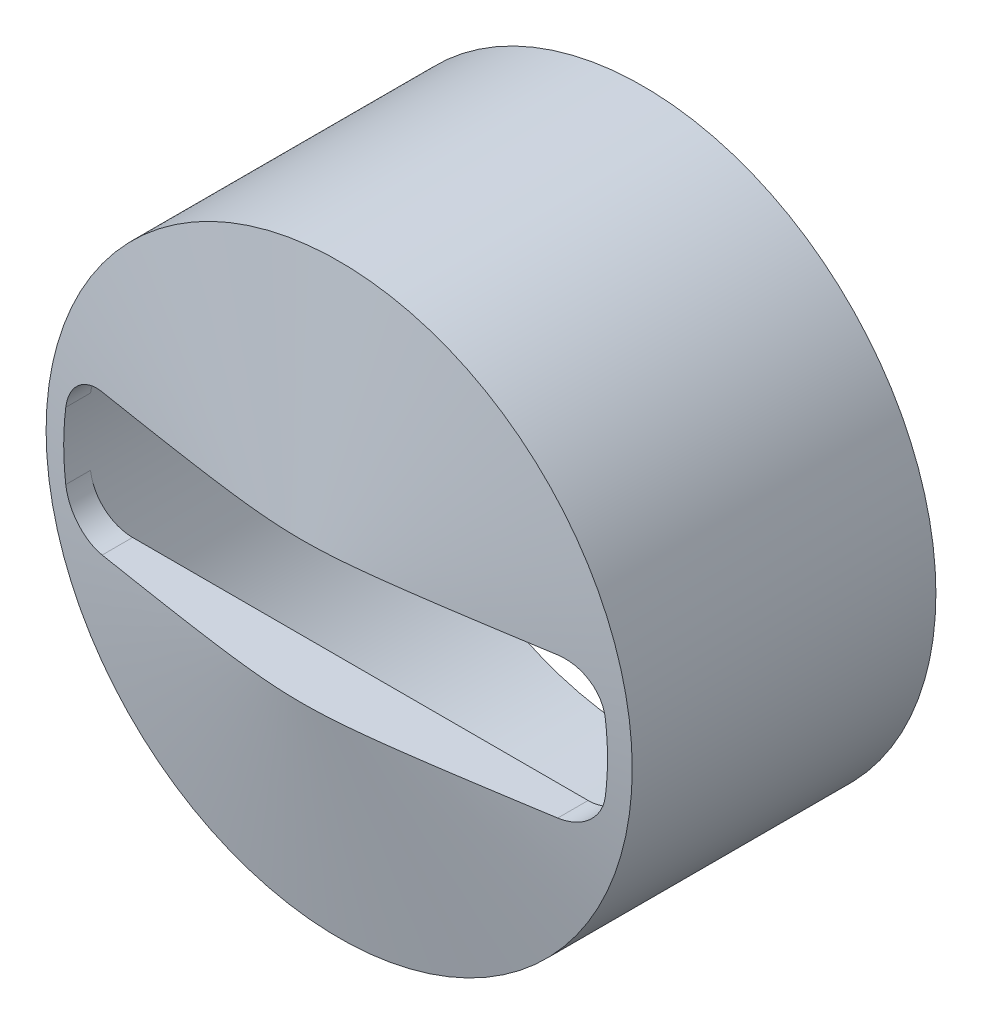
ISO-10303-21;
HEADER;
FILE_DESCRIPTION(('STEP AP214'),'2;1');
FILE_NAME('part.step','',(''),(''),'','','');
FILE_SCHEMA(('AUTOMOTIVE_DESIGN { 1 0 10303 214 1 1 1 1 }'));
ENDSEC;
DATA;
#1=APPLICATION_CONTEXT('core data for automotive mechanical design processes');
#2=APPLICATION_PROTOCOL_DEFINITION('international standard','automotive_design',2000,#1);
#3=PRODUCT_CONTEXT('',#1,'mechanical');
#4=PRODUCT('Part','Part','',(#3));
#5=PRODUCT_RELATED_PRODUCT_CATEGORY('part','',(#4));
#6=PRODUCT_DEFINITION_FORMATION('','',#4);
#7=PRODUCT_DEFINITION_CONTEXT('part definition',#1,'design');
#8=PRODUCT_DEFINITION('design','',#6,#7);
#9=PRODUCT_DEFINITION_SHAPE('','',#8);
#10=(LENGTH_UNIT() NAMED_UNIT(*) SI_UNIT(.MILLI.,.METRE.));
#11=(NAMED_UNIT(*) PLANE_ANGLE_UNIT() SI_UNIT($,.RADIAN.));
#12=(NAMED_UNIT(*) SI_UNIT($,.STERADIAN.) SOLID_ANGLE_UNIT());
#13=UNCERTAINTY_MEASURE_WITH_UNIT(LENGTH_MEASURE(1.E-05),#10,'distance_accuracy_value','');
#14=(GEOMETRIC_REPRESENTATION_CONTEXT(3) GLOBAL_UNCERTAINTY_ASSIGNED_CONTEXT((#13)) GLOBAL_UNIT_ASSIGNED_CONTEXT((#10,
#11,#12)) REPRESENTATION_CONTEXT('',''));
#15=CARTESIAN_POINT('',(0.,0.,0.));
#16=DIRECTION('',(0.,0.,1.));
#17=DIRECTION('',(1.,0.,0.));
#18=AXIS2_PLACEMENT_3D('',#15,#16,#17);
#19=CARTESIAN_POINT('',(476.510652388512,13.7304966360452,-227.105431195113));
#20=DIRECTION('',(0.,0.,1.));
#21=DIRECTION('',(1.,0.,0.));
#22=AXIS2_PLACEMENT_3D('',#19,#20,#21);
#23=PLANE('',#22);
#24=CARTESIAN_POINT('',(444.257745542771,36.9804966360451,-227.105431195113));
#25=DIRECTION('',(0.,0.,1.));
#26=DIRECTION('',(1.,0.,0.));
#27=AXIS2_PLACEMENT_3D('',#24,#25,#26);
#28=CIRCLE('',#27,6.);
#29=CARTESIAN_POINT('',(444.257745542771,42.9804966360451,-227.105431195113));
#30=VERTEX_POINT('',#29);
#31=CARTESIAN_POINT('',(438.303362740362,37.7189581735499,-227.105431195113));
#32=VERTEX_POINT('',#31);
#33=EDGE_CURVE('E101',#30,#32,#28,.T.);
#34=ORIENTED_EDGE('',*,*,#33,.T.);
#35=CARTESIAN_POINT('',(476.510652388512,32.9804966360452,-227.105431195113));
#36=DIRECTION('',(0.,0.,1.));
#37=DIRECTION('',(1.,0.,0.));
#38=AXIS2_PLACEMENT_3D('',#35,#36,#37);
#39=CIRCLE('',#38,38.5);
#40=CARTESIAN_POINT('',(514.717942036543,37.7189581745067,-227.105431195113));
#41=VERTEX_POINT('',#40);
#42=EDGE_CURVE('E89',#32,#41,#39,.F.);
#43=ORIENTED_EDGE('',*,*,#42,.T.);
#44=CARTESIAN_POINT('',(508.763559234252,36.9804966360451,-227.105431195113));
#45=DIRECTION('',(0.,0.,1.));
#46=DIRECTION('',(1.,0.,0.));
#47=AXIS2_PLACEMENT_3D('',#44,#45,#46);
#48=CIRCLE('',#47,6.);
#49=CARTESIAN_POINT('',(508.763559234252,42.9804966360451,-227.105431195113));
#50=VERTEX_POINT('',#49);
#51=EDGE_CURVE('E252',#41,#50,#48,.T.);
#52=ORIENTED_EDGE('',*,*,#51,.T.);
#53=DIRECTION('',(-1.,0.,0.));
#54=VECTOR('',#53,1.);
#55=CARTESIAN_POINT('',(513.689275278554,42.9804966360451,-227.105431195113));
#56=LINE('',#55,#54);
#57=EDGE_CURVE('E115',#50,#30,#56,.T.);
#58=ORIENTED_EDGE('',*,*,#57,.T.);
#59=EDGE_LOOP('',(#34,#43,#52,#58));
#60=FACE_BOUND('',#59,.T.);
#61=ADVANCED_FACE('F16',(#60),#23,.F.);
#62=CARTESIAN_POINT('',(476.510652388512,13.7304966360452,-227.105431195113));
#63=DIRECTION('',(0.,0.,1.));
#64=DIRECTION('',(1.,0.,0.));
#65=AXIS2_PLACEMENT_3D('',#62,#63,#64);
#66=PLANE('',#65);
#67=CARTESIAN_POINT('',(444.257745542771,28.9804966360451,-227.105431195113));
#68=DIRECTION('',(0.,0.,1.));
#69=DIRECTION('',(1.,0.,0.));
#70=AXIS2_PLACEMENT_3D('',#67,#68,#69);
#71=CIRCLE('',#70,6.);
#72=CARTESIAN_POINT('',(438.303362740481,28.2420350975836,-227.105431195113));
#73=VERTEX_POINT('',#72);
#74=CARTESIAN_POINT('',(444.257745542771,22.9804966360451,-227.105431195113));
#75=VERTEX_POINT('',#74);
#76=EDGE_CURVE('E19',#73,#75,#71,.T.);
#77=ORIENTED_EDGE('',*,*,#76,.T.);
#78=DIRECTION('',(1.,0.,0.));
#79=VECTOR('',#78,1.);
#80=CARTESIAN_POINT('',(439.332029498469,22.9804966360451,-227.105431195113));
#81=LINE('',#80,#79);
#82=CARTESIAN_POINT('',(508.763559234252,22.9804966360451,-227.105431195113));
#83=VERTEX_POINT('',#82);
#84=EDGE_CURVE('E121',#75,#83,#81,.T.);
#85=ORIENTED_EDGE('',*,*,#84,.T.);
#86=CARTESIAN_POINT('',(508.763559234252,28.9804966360451,-227.105431195113));
#87=DIRECTION('',(0.,0.,1.));
#88=DIRECTION('',(1.,0.,0.));
#89=AXIS2_PLACEMENT_3D('',#86,#87,#88);
#90=CIRCLE('',#89,6.);
#91=CARTESIAN_POINT('',(514.717942036543,28.2420350975835,-227.105431195113));
#92=VERTEX_POINT('',#91);
#93=EDGE_CURVE('E84',#83,#92,#90,.T.);
#94=ORIENTED_EDGE('',*,*,#93,.T.);
#95=CARTESIAN_POINT('',(476.510652388512,32.9804966360452,-227.105431195113));
#96=DIRECTION('',(0.,0.,1.));
#97=DIRECTION('',(1.,0.,0.));
#98=AXIS2_PLACEMENT_3D('',#95,#96,#97);
#99=CIRCLE('',#98,38.5);
#100=EDGE_CURVE('E80',#92,#73,#99,.F.);
#101=ORIENTED_EDGE('',*,*,#100,.T.);
#102=EDGE_LOOP('',(#77,#85,#94,#101));
#103=FACE_BOUND('',#102,.T.);
#104=ADVANCED_FACE('F82',(#103),#66,.F.);
#105=CARTESIAN_POINT('',(444.257745542771,28.9804966360451,-247.105431195113));
#106=DIRECTION('',(0.,0.,1.));
#107=DIRECTION('',(1.,0.,0.));
#108=AXIS2_PLACEMENT_3D('',#105,#106,#107);
#109=CYLINDRICAL_SURFACE('',#108,6.);
#110=ORIENTED_EDGE('',*,*,#76,.F.);
#111=DIRECTION('',(0.,0.,1.));
#112=VECTOR('',#111,1.);
#113=CARTESIAN_POINT('',(438.303362740481,28.2420350975836,-247.105431195113));
#114=LINE('',#113,#112);
#115=CARTESIAN_POINT('',(438.303362740481,28.2420350975836,-223.599407098727));
#116=VERTEX_POINT('',#115);
#117=EDGE_CURVE('E95',#73,#116,#114,.T.);
#118=ORIENTED_EDGE('',*,*,#117,.T.);
#119=CARTESIAN_POINT('',(444.257745542771,22.9804966360451,-222.801168931707));
#120=CARTESIAN_POINT('',(444.088265183198,22.9804792315409,-222.828475373853));
#121=CARTESIAN_POINT('',(443.918730672621,22.987676871564,-222.855447346103));
#122=CARTESIAN_POINT('',(443.580750608113,23.0164052577463,-222.908570143717));
#123=CARTESIAN_POINT('',(443.412305056264,23.0379360313151,-222.93472096751));
#124=CARTESIAN_POINT('',(443.07774089937,23.095226838694,-222.986043008158));
#125=CARTESIAN_POINT('',(442.911621746611,23.1309834629119,-223.011214458157));
#126=CARTESIAN_POINT('',(442.582863811955,23.2165036372161,-223.060443216539));
#127=CARTESIAN_POINT('',(442.420224944637,23.2662668430968,-223.084500552282));
#128=CARTESIAN_POINT('',(442.099507640067,23.3795192274718,-223.131383008393));
#129=CARTESIAN_POINT('',(441.941431862303,23.4430162343418,-223.154207416669));
#130=CARTESIAN_POINT('',(441.631035376635,23.5833295694724,-223.198494251523));
#131=CARTESIAN_POINT('',(441.478716814985,23.6601508064218,-223.219956172159));
#132=CARTESIAN_POINT('',(441.181135242669,23.8265171130388,-223.261378702388));
#133=CARTESIAN_POINT('',(441.035866905209,23.9160523693078,-223.281340451892));
#134=CARTESIAN_POINT('',(440.753292387419,24.1073123821174,-223.319682726787));
#135=CARTESIAN_POINT('',(440.61598896145,24.2090413185259,-223.338062706234));
#136=CARTESIAN_POINT('',(440.351514664938,24.4230781065538,-223.372994863474));
#137=CARTESIAN_POINT('',(440.224270253254,24.535292857565,-223.389560732658));
#138=CARTESIAN_POINT('',(439.979631374492,24.7702119427477,-223.420951091159));
#139=CARTESIAN_POINT('',(439.862236801206,24.8929161637853,-223.435775599253));
#140=CARTESIAN_POINT('',(439.638100893166,25.1480386394975,-223.463618137349));
#141=CARTESIAN_POINT('',(439.531366940116,25.2804635164406,-223.476634918033));
#142=CARTESIAN_POINT('',(439.329488392693,25.5539591577887,-223.500780080099));
#143=CARTESIAN_POINT('',(439.234339604861,25.6950267658427,-223.511909145349));
#144=CARTESIAN_POINT('',(439.057159692707,25.9834515218147,-223.532131885614));
#145=CARTESIAN_POINT('',(438.975012143464,26.1307358747739,-223.541243956031));
#146=CARTESIAN_POINT('',(438.823396509135,26.4317257329324,-223.557518664039));
#147=CARTESIAN_POINT('',(438.753923479957,26.5854287054726,-223.564682062309));
#148=CARTESIAN_POINT('',(438.628224799482,26.8979895530524,-223.577020668529));
#149=CARTESIAN_POINT('',(438.571981403668,27.0568401943212,-223.582198545546));
#150=CARTESIAN_POINT('',(438.473064071239,27.3786917587751,-223.590552520025));
#151=CARTESIAN_POINT('',(438.430382925198,27.5416904270076,-223.593729681914));
#152=CARTESIAN_POINT('',(438.37536902988,27.7947986111035,-223.597069570708));
#153=CARTESIAN_POINT('',(438.358117694344,27.8838574871378,-223.597946751523));
#154=CARTESIAN_POINT('',(438.327690994624,28.0625354728578,-223.599115063111));
#155=CARTESIAN_POINT('',(438.314509569688,28.1521535447681,-223.599407068902));
#156=CARTESIAN_POINT('',(438.303362740481,28.2420350975835,-223.599407098728));
#157=B_SPLINE_CURVE_WITH_KNOTS('',3,(#119,#120,#121,#122,#123,#124,#125,#126,#127,#128,#129,
#130,#131,#132,#133,#134,#135,#136,#137,#138,#139,#140,#141,#142,#143,#144,#145,#146,#147,#148,
#149,#150,#151,#152,#153,#154,#155,#156),.UNSPECIFIED.,.F.,.F.,(4,2,2,2,2,2,2,2,2,2,2,2,2,2,2,2,
2,2,4),(0.,0.514847598617484,1.02969618179499,1.54442144248745,2.05913405513231,
2.57414083490361,3.08933774937819,3.60413914571362,4.11911751806192,4.62989354159285,
5.14066405686046,5.6517858267849,6.16272203352415,6.66878652828944,7.17465319275248,
7.67983743414314,8.1847526784545,8.45682439264852,8.72848897214539),.UNSPECIFIED.);
#158=CARTESIAN_POINT('',(444.257745542771,22.9804966360451,-222.801168931707));
#159=VERTEX_POINT('',#158);
#160=EDGE_CURVE('E178',#159,#116,#157,.T.);
#161=ORIENTED_EDGE('',*,*,#160,.F.);
#162=DIRECTION('',(0.,0.,1.));
#163=VECTOR('',#162,1.);
#164=CARTESIAN_POINT('',(444.257745542771,22.9804966360451,-212.105429895113));
#165=LINE('',#164,#163);
#166=EDGE_CURVE('E98',#159,#75,#165,.F.);
#167=ORIENTED_EDGE('',*,*,#166,.T.);
#168=EDGE_LOOP('',(#110,#118,#161,#167));
#169=FACE_BOUND('',#168,.T.);
#170=ADVANCED_FACE('F93',(#169),#109,.F.);
#171=CARTESIAN_POINT('',(444.257745542771,36.9804966360451,-247.105431195113));
#172=DIRECTION('',(0.,0.,1.));
#173=DIRECTION('',(1.,0.,0.));
#174=AXIS2_PLACEMENT_3D('',#171,#172,#173);
#175=CYLINDRICAL_SURFACE('',#174,6.);
#176=CARTESIAN_POINT('',(438.303362740243,37.7189581725932,-223.599407098728));
#177=CARTESIAN_POINT('',(438.323956592469,37.8851654079298,-223.599408823167));
#178=CARTESIAN_POINT('',(438.351545882916,38.050501899813,-223.598408724818));
#179=CARTESIAN_POINT('',(438.420431162792,38.3782591904442,-223.594417391853));
#180=CARTESIAN_POINT('',(438.461726255271,38.5406801792584,-223.591426287523));
#181=CARTESIAN_POINT('',(438.557696303835,38.8613025478433,-223.583469215302));
#182=CARTESIAN_POINT('',(438.612358562434,39.0195077749353,-223.578505118777));
#183=CARTESIAN_POINT('',(438.734673466902,39.330736265787,-223.566626494243));
#184=CARTESIAN_POINT('',(438.802325997013,39.4837595757091,-223.559711983614));
#185=CARTESIAN_POINT('',(438.950140304236,39.7835787185786,-223.543963910147));
#186=CARTESIAN_POINT('',(439.030304828933,39.9303731746672,-223.535129925634));
#187=CARTESIAN_POINT('',(439.202572930595,40.2167225207025,-223.515582827179));
#188=CARTESIAN_POINT('',(439.294680891086,40.356274726108,-223.504869022786));
#189=CARTESIAN_POINT('',(439.490081814046,40.6270347732119,-223.481622792588));
#190=CARTESIAN_POINT('',(439.593368520809,40.7582472173098,-223.469091382607));
#191=CARTESIAN_POINT('',(439.81045261408,41.0115533077411,-223.442261554087));
#192=CARTESIAN_POINT('',(439.924253664513,41.1336437483276,-223.427962518993));
#193=CARTESIAN_POINT('',(440.16195091003,41.3682586848786,-223.39761420654));
#194=CARTESIAN_POINT('',(440.285883036262,41.4807459603078,-223.381558624681));
#195=CARTESIAN_POINT('',(440.5425745007,41.6948832363867,-223.347820015182));
#196=CARTESIAN_POINT('',(440.675333922439,41.7965331344581,-223.33013697214));
#197=CARTESIAN_POINT('',(440.948810794545,41.9883771385032,-223.293219594412));
#198=CARTESIAN_POINT('',(441.089533285873,42.0785638678588,-223.27398427371));
#199=CARTESIAN_POINT('',(441.377804558122,42.2467838158463,-223.234075495072));
#200=CARTESIAN_POINT('',(441.525351062649,42.3248210499877,-223.213402515576));
#201=CARTESIAN_POINT('',(441.827836618109,42.4690216424545,-223.170495357842));
#202=CARTESIAN_POINT('',(441.982836619402,42.5350529891969,-223.14824717219));
#203=CARTESIAN_POINT('',(442.297618735588,42.6537839033297,-223.102508820592));
#204=CARTESIAN_POINT('',(442.457399124463,42.7064882191674,-223.079019100623));
#205=CARTESIAN_POINT('',(442.780488601855,42.7982183309172,-223.030941730059));
#206=CARTESIAN_POINT('',(442.943793828278,42.8372583637428,-223.006355252487));
#207=CARTESIAN_POINT('',(443.272890892546,42.9014889094099,-222.956204034997));
#208=CARTESIAN_POINT('',(443.438681535539,42.9266858709398,-222.930639756526));
#209=CARTESIAN_POINT('',(443.713629316459,42.9567708546721,-222.887724201054));
#210=CARTESIAN_POINT('',(443.822400852045,42.965675694415,-222.870613369253));
#211=CARTESIAN_POINT('',(444.040034053232,42.9775343028682,-222.836103937839));
#212=CARTESIAN_POINT('',(444.148895258698,42.9804980665822,-222.818705871272));
#213=CARTESIAN_POINT('',(444.257745542771,42.9804966360451,-222.801168931707));
#214=B_SPLINE_CURVE_WITH_KNOTS('',3,(#176,#177,#178,#179,#180,#181,#182,#183,#184,#185,#186,
#187,#188,#189,#190,#191,#192,#193,#194,#195,#196,#197,#198,#199,#200,#201,#202,#203,#204,#205,
#206,#207,#208,#209,#210,#211,#212,#213),.UNSPECIFIED.,.F.,.F.,(4,2,2,2,2,2,2,2,2,2,2,2,2,2,2,2,
2,2,4),(0.,0.502279613814994,1.00452636344582,1.50629786899053,2.00806490338102,
2.50994227929075,3.01200438031805,3.51378696243279,4.01574506462552,4.51956784787002,
5.02339539948853,5.52754554316481,6.0315287056516,6.54075638346385,7.04980236597902,
7.5583163798917,8.06659330516284,8.39785024474974,8.72854942302032),.UNSPECIFIED.);
#215=CARTESIAN_POINT('',(438.303362740244,37.7189581725931,-223.599407098728));
#216=VERTEX_POINT('',#215);
#217=CARTESIAN_POINT('',(444.257745542771,42.9804966360451,-222.801168931707));
#218=VERTEX_POINT('',#217);
#219=EDGE_CURVE('E169',#216,#218,#214,.T.);
#220=ORIENTED_EDGE('',*,*,#219,.F.);
#221=DIRECTION('',(0.,0.,1.));
#222=VECTOR('',#221,1.);
#223=CARTESIAN_POINT('',(438.303362740244,37.7189581725931,-247.105431195113));
#224=LINE('',#223,#222);
#225=EDGE_CURVE('E108',#216,#32,#224,.F.);
#226=ORIENTED_EDGE('',*,*,#225,.T.);
#227=ORIENTED_EDGE('',*,*,#33,.F.);
#228=DIRECTION('',(0.,0.,1.));
#229=VECTOR('',#228,1.);
#230=CARTESIAN_POINT('',(444.257745542771,42.9804966360451,-212.105429895113));
#231=LINE('',#230,#229);
#232=EDGE_CURVE('E127',#30,#218,#231,.T.);
#233=ORIENTED_EDGE('',*,*,#232,.T.);
#234=EDGE_LOOP('',(#220,#226,#227,#233));
#235=FACE_BOUND('',#234,.T.);
#236=ADVANCED_FACE('F189',(#235),#175,.F.);
#237=CARTESIAN_POINT('',(513.689275278554,42.9804966360451,-212.105429895113));
#238=DIRECTION('',(0.,1.,0.));
#239=DIRECTION('',(-1.,0.,0.));
#240=AXIS2_PLACEMENT_3D('',#237,#238,#239);
#241=PLANE('',#240);
#242=ORIENTED_EDGE('',*,*,#57,.F.);
#243=DIRECTION('',(0.,0.,1.));
#244=VECTOR('',#243,1.);
#245=CARTESIAN_POINT('',(508.763559234252,42.9804966360451,-247.105431195113));
#246=LINE('',#245,#244);
#247=CARTESIAN_POINT('',(508.763559234252,42.9804966360451,-222.801168931707));
#248=VERTEX_POINT('',#247);
#249=EDGE_CURVE('E90',#50,#248,#246,.T.);
#250=ORIENTED_EDGE('',*,*,#249,.T.);
#251=CARTESIAN_POINT('',(444.257745542771,42.9804966360451,-222.801168931707));
#252=CARTESIAN_POINT('',(444.929257003277,42.9804966360451,-222.692987994748));
#253=CARTESIAN_POINT('',(445.600813524253,42.9804966360451,-222.585085850551));
#254=CARTESIAN_POINT('',(446.944037819608,42.9804966360451,-222.369972772591));
#255=CARTESIAN_POINT('',(447.61570559408,42.9804966360451,-222.262761839414));
#256=CARTESIAN_POINT('',(448.959220729765,42.9804966360451,-222.049157306831));
#257=CARTESIAN_POINT('',(449.631068100423,42.9804966360451,-221.942763766793));
#258=CARTESIAN_POINT('',(450.974921367792,42.9804966360451,-221.73098265991));
#259=CARTESIAN_POINT('',(451.64692726448,42.9804966360451,-221.625595092909));
#260=CARTESIAN_POINT('',(452.995676775984,42.9804966360451,-221.415349406784));
#261=CARTESIAN_POINT('',(453.672421701118,42.9804966360451,-221.310499686102));
#262=CARTESIAN_POINT('',(455.026152416159,42.9804966360451,-221.102367359215));
#263=CARTESIAN_POINT('',(455.703138205941,42.9804966360451,-220.999084752204));
#264=CARTESIAN_POINT('',(457.057372338055,42.9804966360451,-220.794510314637));
#265=CARTESIAN_POINT('',(457.734620663624,42.9804966360451,-220.693218373293));
#266=CARTESIAN_POINT('',(459.089495266412,42.9804966360451,-220.493187114378));
#267=CARTESIAN_POINT('',(459.767121543754,42.9804966360451,-220.394447797645));
#268=CARTESIAN_POINT('',(461.11213318284,42.9804966360451,-220.201841110782));
#269=CARTESIAN_POINT('',(461.779511024633,42.9804966360451,-220.107921387542));
#270=CARTESIAN_POINT('',(463.114857642794,42.9804966360451,-219.924355572378));
#271=CARTESIAN_POINT('',(463.782826419881,42.9804966360451,-219.834709485656));
#272=CARTESIAN_POINT('',(465.119684348475,42.9804966360451,-219.661127785197));
#273=CARTESIAN_POINT('',(465.788573691763,42.9804966360451,-219.577193638632));
#274=CARTESIAN_POINT('',(467.127294776804,42.9804966360451,-219.417101711624));
#275=CARTESIAN_POINT('',(467.79712652324,42.9804966360451,-219.34094396996));
#276=CARTESIAN_POINT('',(469.135747363744,42.9804966360451,-219.19943226934));
#277=CARTESIAN_POINT('',(469.804532774543,42.9804966360451,-219.134044012497));
#278=CARTESIAN_POINT('',(471.143357841532,42.9804966360451,-219.017339960886));
#279=CARTESIAN_POINT('',(471.813397504719,42.9804966360451,-218.966024244868));
#280=CARTESIAN_POINT('',(473.154308184907,42.9804966360451,-218.881569704378));
#281=CARTESIAN_POINT('',(473.825178556574,42.9804966360451,-218.848421067477));
#282=CARTESIAN_POINT('',(474.831986529327,42.9804966360451,-218.814873428873));
#283=CARTESIAN_POINT('',(475.167664550781,42.9804966360451,-218.806386778759));
#284=CARTESIAN_POINT('',(475.839113406506,42.9804966360451,-218.795039789362));
#285=CARTESIAN_POINT('',(476.17488423882,42.9804966360451,-218.792179339315));
#286=CARTESIAN_POINT('',(476.720929561642,42.9804966360451,-218.792177458955));
#287=CARTESIAN_POINT('',(476.931205682652,42.9804966360451,-218.79329814387));
#288=CARTESIAN_POINT('',(477.351731291889,42.9804966360451,-218.797763612797));
#289=CARTESIAN_POINT('',(477.56198078043,42.9804966360451,-218.801108367486));
#290=CARTESIAN_POINT('',(478.192686583347,42.9804966360451,-218.814426808406));
#291=CARTESIAN_POINT('',(478.613077333679,42.9804966360451,-218.827684664855));
#292=CARTESIAN_POINT('',(479.453710988582,42.9804966360451,-218.862364397567));
#293=CARTESIAN_POINT('',(479.873953731432,42.9804966360451,-218.88379009853));
#294=CARTESIAN_POINT('',(480.713993039833,42.9804966360451,-218.933927708734));
#295=CARTESIAN_POINT('',(481.133789612392,42.9804966360451,-218.962639501805));
#296=CARTESIAN_POINT('',(481.973250278499,42.9804966360451,-219.026393264304));
#297=CARTESIAN_POINT('',(482.392913966503,42.9804966360451,-219.061440516205));
#298=CARTESIAN_POINT('',(483.231759651959,42.9804966360451,-219.136875007877));
#299=CARTESIAN_POINT('',(483.650941646606,42.9804966360451,-219.17726227859));
#300=CARTESIAN_POINT('',(484.488804871406,42.9804966360451,-219.262484658446));
#301=CARTESIAN_POINT('',(484.90748615046,42.9804966360451,-219.307319289929));
#302=CARTESIAN_POINT('',(485.744434462983,42.9804966360451,-219.400673174878));
#303=CARTESIAN_POINT('',(486.16270149754,42.9804966360451,-219.449192418643));
#304=CARTESIAN_POINT('',(487.045395412619,42.9804966360451,-219.554838320319));
#305=CARTESIAN_POINT('',(487.509779426945,42.9804966360451,-219.612321984351));
#306=CARTESIAN_POINT('',(488.43816185956,42.9804966360451,-219.730329617651));
#307=CARTESIAN_POINT('',(488.902160275705,42.9804966360451,-219.7908536037));
#308=CARTESIAN_POINT('',(490.293682556971,42.9804966360451,-219.976101721925));
#309=CARTESIAN_POINT('',(491.220716753485,42.9804966360451,-220.104499970045));
#310=CARTESIAN_POINT('',(493.073950665399,42.9804966360451,-220.36785989432));
#311=CARTESIAN_POINT('',(494.000150273775,42.9804966360451,-220.502822316062));
#312=CARTESIAN_POINT('',(495.851876083976,42.9804966360451,-220.777305270155));
#313=CARTESIAN_POINT('',(496.777402282997,42.9804966360451,-220.916825821381));
#314=CARTESIAN_POINT('',(498.625261020106,42.9804966360451,-221.198708765353));
#315=CARTESIAN_POINT('',(499.54759500634,42.9804966360451,-221.341061693622));
#316=CARTESIAN_POINT('',(501.391895499977,42.9804966360451,-221.628148183026));
#317=CARTESIAN_POINT('',(502.313862005958,42.9804966360451,-221.772881753277));
#318=CARTESIAN_POINT('',(504.157245094902,42.9804966360451,-222.064092698627));
#319=CARTESIAN_POINT('',(505.078661759806,42.9804966360451,-222.210569555779));
#320=CARTESIAN_POINT('',(506.92126597467,42.9804966360451,-222.504919146084));
#321=CARTESIAN_POINT('',(507.842453526101,42.9804966360451,-222.652791870028));
#322=CARTESIAN_POINT('',(508.763559234252,42.9804966360451,-222.801168931707));
#323=B_SPLINE_CURVE_WITH_KNOTS('',3,(#251,#252,#253,#254,#255,#256,#257,#258,#259,#260,#261,
#262,#263,#264,#265,#266,#267,#268,#269,#270,#271,#272,#273,#274,#275,#276,#277,#278,#279,#280,
#281,#282,#283,#284,#285,#286,#287,#288,#289,#290,#291,#292,#293,#294,#295,#296,#297,#298,#299,
#300,#301,#302,#303,#304,#305,#306,#307,#308,#309,#310,#311,#312,#313,#314,#315,#316,#317,#318,
#319,#320,#321,#322),.UNSPECIFIED.,.F.,.F.,(4,2,2,2,2,2,2,2,2,2,2,2,2,2,2,2,2,2,2,2,2,2,2,2,2,2,
2,2,2,2,2,2,2,2,2,4),(0.,2.0405091164688,4.08101995627166,6.12167762253234,8.16233497442326,
10.2167907364041,12.2712454397126,14.3255854792546,16.379926193186,18.4017782320467,
20.4236327315444,22.4460046208833,24.4683865946628,26.4841977868535,28.5000202593428,
30.5147528672795,31.522068963968,32.5293652293754,33.1601916236845,33.7910097014751,
35.0527145472362,36.3150109298113,37.5772871872064,38.8406208196461,40.1039617726613,
41.3671671857637,42.6303692737483,44.0341413904972,45.4379212552681,48.2455314600391,
51.053461313653,53.8614027967511,56.6611629946032,59.4609339158216,62.2598927927486,
65.0588332163392),.UNSPECIFIED.);
#324=EDGE_CURVE('E211',#218,#248,#323,.T.);
#325=ORIENTED_EDGE('',*,*,#324,.F.);
#326=ORIENTED_EDGE('',*,*,#232,.F.);
#327=EDGE_LOOP('',(#242,#250,#325,#326));
#328=FACE_BOUND('',#327,.T.);
#329=ADVANCED_FACE('F219',(#328),#241,.F.);
#330=CARTESIAN_POINT('',(508.763559234252,36.9804966360451,-247.105431195113));
#331=DIRECTION('',(0.,0.,1.));
#332=DIRECTION('',(1.,0.,0.));
#333=AXIS2_PLACEMENT_3D('',#330,#331,#332);
#334=CYLINDRICAL_SURFACE('',#333,6.);
#335=ORIENTED_EDGE('',*,*,#51,.F.);
#336=DIRECTION('',(0.,0.,1.));
#337=VECTOR('',#336,1.);
#338=CARTESIAN_POINT('',(514.717942036543,37.7189581745067,-247.105431195113));
#339=LINE('',#338,#337);
#340=CARTESIAN_POINT('',(514.717942036542,37.7189581745066,-223.599407098727));
#341=VERTEX_POINT('',#340);
#342=EDGE_CURVE('E236',#41,#341,#339,.T.);
#343=ORIENTED_EDGE('',*,*,#342,.T.);
#344=CARTESIAN_POINT('',(508.763559234252,42.9804966360451,-222.801168931707));
#345=CARTESIAN_POINT('',(508.933039593825,42.9805140405494,-222.828475373853));
#346=CARTESIAN_POINT('',(509.102574104402,42.9733164005262,-222.855447346103));
#347=CARTESIAN_POINT('',(509.44055416891,42.9445880143439,-222.908570143716));
#348=CARTESIAN_POINT('',(509.608999720758,42.9230572407751,-222.93472096751));
#349=CARTESIAN_POINT('',(509.943563877653,42.8657664333962,-222.986043008157));
#350=CARTESIAN_POINT('',(510.109683030411,42.8300098091783,-223.011214458157));
#351=CARTESIAN_POINT('',(510.438440965068,42.7444896348741,-223.060443216538));
#352=CARTESIAN_POINT('',(510.601079832386,42.6947264289934,-223.084500552282));
#353=CARTESIAN_POINT('',(510.921797136956,42.5814740446184,-223.131383008392));
#354=CARTESIAN_POINT('',(511.07987291472,42.5179770377484,-223.154207416669));
#355=CARTESIAN_POINT('',(511.390269400388,42.3776637026179,-223.198494251522));
#356=CARTESIAN_POINT('',(511.542587962038,42.3008424656684,-223.219956172159));
#357=CARTESIAN_POINT('',(511.840169534354,42.1344761590515,-223.261378702388));
#358=CARTESIAN_POINT('',(511.985437871814,42.0449409027825,-223.281340451892));
#359=CARTESIAN_POINT('',(512.268012389604,41.8536808899729,-223.319682726787));
#360=CARTESIAN_POINT('',(512.405315815573,41.7519519535644,-223.338062706234));
#361=CARTESIAN_POINT('',(512.669790112085,41.5379151655364,-223.372994863474));
#362=CARTESIAN_POINT('',(512.797034523769,41.4257004145252,-223.389560732658));
#363=CARTESIAN_POINT('',(513.041673402531,41.1907813293425,-223.420951091159));
#364=CARTESIAN_POINT('',(513.159067975817,41.0680771083049,-223.435775599253));
#365=CARTESIAN_POINT('',(513.383203883857,40.8129546325927,-223.463618137349));
#366=CARTESIAN_POINT('',(513.489937836907,40.6805297556495,-223.476634918033));
#367=CARTESIAN_POINT('',(513.69181638433,40.4070341143014,-223.500780080098));
#368=CARTESIAN_POINT('',(513.786965172162,40.2659665062475,-223.511909145349));
#369=CARTESIAN_POINT('',(513.964145084316,39.9775417502754,-223.532131885614));
#370=CARTESIAN_POINT('',(514.046292633559,39.8302573973162,-223.54124395603));
#371=CARTESIAN_POINT('',(514.197908267888,39.5292675391577,-223.557518664039));
#372=CARTESIAN_POINT('',(514.267381297066,39.3755645666175,-223.564682062309));
#373=CARTESIAN_POINT('',(514.393079977541,39.0630037190378,-223.577020668528));
#374=CARTESIAN_POINT('',(514.449323373355,38.904153077769,-223.582198545545));
#375=CARTESIAN_POINT('',(514.548240705784,38.5823015133152,-223.590552520025));
#376=CARTESIAN_POINT('',(514.590921851825,38.4193028450826,-223.593729681914));
#377=CARTESIAN_POINT('',(514.645935747143,38.1661946609867,-223.597069570708));
#378=CARTESIAN_POINT('',(514.663187082679,38.0771357849524,-223.597946751522));
#379=CARTESIAN_POINT('',(514.693613782399,37.8984577992324,-223.599115063111));
#380=CARTESIAN_POINT('',(514.706795207335,37.8088397273221,-223.599407068901));
#381=CARTESIAN_POINT('',(514.717942036543,37.7189581745067,-223.599407098727));
#382=B_SPLINE_CURVE_WITH_KNOTS('',3,(#344,#345,#346,#347,#348,#349,#350,#351,#352,#353,#354,
#355,#356,#357,#358,#359,#360,#361,#362,#363,#364,#365,#366,#367,#368,#369,#370,#371,#372,#373,
#374,#375,#376,#377,#378,#379,#380,#381),.UNSPECIFIED.,.F.,.F.,(4,2,2,2,2,2,2,2,2,2,2,2,2,2,2,2,
2,2,4),(0.,0.514847598617543,1.02969618179493,1.54442144248746,2.05913405513231,
2.57414083490354,3.08933774937806,3.60413914571347,4.11911751806185,4.62989354159286,
5.1406640568605,5.651785826785,6.16272203352424,6.66878652828951,7.1746531927525,
7.67983743414312,8.1847526784545,8.45682439264852,8.72848897214541),.UNSPECIFIED.);
#383=EDGE_CURVE('E159',#248,#341,#382,.T.);
#384=ORIENTED_EDGE('',*,*,#383,.F.);
#385=ORIENTED_EDGE('',*,*,#249,.F.);
#386=EDGE_LOOP('',(#335,#343,#384,#385));
#387=FACE_BOUND('',#386,.T.);
#388=ADVANCED_FACE('F222',(#387),#334,.F.);
#389=CARTESIAN_POINT('',(476.510652388512,32.9804966360452,-247.105431195113));
#390=DIRECTION('',(0.,0.,1.));
#391=DIRECTION('',(1.,0.,0.));
#392=AXIS2_PLACEMENT_3D('',#389,#390,#391);
#393=CYLINDRICAL_SURFACE('',#392,38.5);
#394=CARTESIAN_POINT('',(476.510652388512,32.9804966360452,-267.105431195113));
#395=DIRECTION('',(0.,0.,1.));
#396=DIRECTION('',(1.,0.,0.));
#397=AXIS2_PLACEMENT_3D('',#394,#395,#396);
#398=CIRCLE('',#397,38.5);
#399=CARTESIAN_POINT('',(515.010652388512,32.9804966360452,-267.105431195113));
#400=VERTEX_POINT('',#399);
#401=EDGE_CURVE('E208',#400,#400,#398,.F.);
#402=ORIENTED_EDGE('',*,*,#401,.T.);
#403=EDGE_LOOP('',(#402));
#404=FACE_BOUND('',#403,.T.);
#405=CARTESIAN_POINT('',(476.510652388512,32.9804966360452,-223.599407098727));
#406=DIRECTION('',(0.,0.,-1.));
#407=DIRECTION('',(0.,-1.,0.));
#408=AXIS2_PLACEMENT_3D('',#405,#406,#407);
#409=CIRCLE('',#408,38.4999999999991);
#410=CARTESIAN_POINT('',(514.717942036661,28.2420350985399,-223.599407098727));
#411=VERTEX_POINT('',#410);
#412=EDGE_CURVE('E245',#341,#411,#409,.T.);
#413=ORIENTED_EDGE('',*,*,#412,.F.);
#414=ORIENTED_EDGE('',*,*,#342,.F.);
#415=ORIENTED_EDGE('',*,*,#42,.F.);
#416=ORIENTED_EDGE('',*,*,#225,.F.);
#417=CARTESIAN_POINT('',(476.510652388512,32.9804966360452,-223.599407098727));
#418=DIRECTION('',(0.,0.,-1.));
#419=DIRECTION('',(0.,-1.,0.));
#420=AXIS2_PLACEMENT_3D('',#417,#418,#419);
#421=CIRCLE('',#420,38.5000000000002);
#422=EDGE_CURVE('E105',#116,#216,#421,.T.);
#423=ORIENTED_EDGE('',*,*,#422,.F.);
#424=ORIENTED_EDGE('',*,*,#117,.F.);
#425=ORIENTED_EDGE('',*,*,#100,.F.);
#426=DIRECTION('',(0.,0.,1.));
#427=VECTOR('',#426,1.);
#428=CARTESIAN_POINT('',(514.717942036543,28.2420350975835,-247.105431195113));
#429=LINE('',#428,#427);
#430=EDGE_CURVE('E124',#92,#411,#429,.T.);
#431=ORIENTED_EDGE('',*,*,#430,.T.);
#432=EDGE_LOOP('',(#413,#414,#415,#416,#423,#424,#425,#431));
#433=FACE_BOUND('',#432,.T.);
#434=ADVANCED_FACE('F103',(#404,#433),#393,.F.);
#435=CARTESIAN_POINT('',(508.763559234252,28.9804966360451,-247.105431195113));
#436=DIRECTION('',(0.,0.,1.));
#437=DIRECTION('',(1.,0.,0.));
#438=AXIS2_PLACEMENT_3D('',#435,#436,#437);
#439=CYLINDRICAL_SURFACE('',#438,6.);
#440=ORIENTED_EDGE('',*,*,#93,.F.);
#441=DIRECTION('',(0.,0.,1.));
#442=VECTOR('',#441,1.);
#443=CARTESIAN_POINT('',(508.763559234252,22.9804966360451,-212.105429895113));
#444=LINE('',#443,#442);
#445=CARTESIAN_POINT('',(508.763559314894,22.9804966360451,-222.801168944699));
#446=VERTEX_POINT('',#445);
#447=EDGE_CURVE('E35',#83,#446,#444,.T.);
#448=ORIENTED_EDGE('',*,*,#447,.T.);
#449=CARTESIAN_POINT('',(514.71794203678,28.2420350994962,-223.599407098727));
#450=CARTESIAN_POINT('',(514.697348184555,28.0758278641611,-223.599408823167));
#451=CARTESIAN_POINT('',(514.669758894107,27.9104913722794,-223.598408724818));
#452=CARTESIAN_POINT('',(514.600873614232,27.5827340816511,-223.594417391853));
#453=CARTESIAN_POINT('',(514.559578521753,27.4203130928383,-223.591426287522));
#454=CARTESIAN_POINT('',(514.46360847319,27.0996907242533,-223.583469215302));
#455=CARTESIAN_POINT('',(514.408946214591,26.9414854971598,-223.578505118777));
#456=CARTESIAN_POINT('',(514.286631310122,26.6302570063053,-223.566626494243));
#457=CARTESIAN_POINT('',(514.21897878001,26.4772336963817,-223.559711983613));
#458=CARTESIAN_POINT('',(514.071164472786,26.1774145535092,-223.543963910147));
#459=CARTESIAN_POINT('',(513.990999948088,26.030620097419,-223.535129925633));
#460=CARTESIAN_POINT('',(513.818731846423,25.7442707513806,-223.515582827178));
#461=CARTESIAN_POINT('',(513.726623885932,25.6047185459736,-223.504869022785));
#462=CARTESIAN_POINT('',(513.531222962971,25.3339584988701,-223.481622792588));
#463=CARTESIAN_POINT('',(513.427936256209,25.2027460547738,-223.469091382607));
#464=CARTESIAN_POINT('',(513.21085216294,24.9494399643457,-223.442261554086));
#465=CARTESIAN_POINT('',(513.097051112508,24.8273495237606,-223.427962518992));
#466=CARTESIAN_POINT('',(512.859353866997,24.5927345872156,-223.39761420654));
#467=CARTESIAN_POINT('',(512.73542174077,24.4802473117905,-223.381558624682));
#468=CARTESIAN_POINT('',(512.478730276343,24.2661100357191,-223.347820015184));
#469=CARTESIAN_POINT('',(512.345970854609,24.1644601376509,-223.330136972143));
#470=CARTESIAN_POINT('',(512.072493982504,23.9726161336042,-223.293219594416));
#471=CARTESIAN_POINT('',(511.931771491171,23.8824294042443,-223.273984273713));
#472=CARTESIAN_POINT('',(511.643500218911,23.7142094562495,-223.234075495073));
#473=CARTESIAN_POINT('',(511.495953714379,23.6361722221049,-223.213402515577));
#474=CARTESIAN_POINT('',(511.193468158892,23.4919716296252,-223.170495357839));
#475=CARTESIAN_POINT('',(511.038468157576,23.4259402828743,-223.148247172184));
#476=CARTESIAN_POINT('',(510.723686041344,23.3072093687287,-223.102508820578));
#477=CARTESIAN_POINT('',(510.563905652446,23.2545050528865,-223.079019100606));
#478=CARTESIAN_POINT('',(510.240816175049,23.1627749411431,-223.030941730041));
#479=CARTESIAN_POINT('',(510.077510948644,23.123734908325,-223.006355252471));
#480=CARTESIAN_POINT('',(509.748413884418,23.0595043626715,-222.956204034987));
#481=CARTESIAN_POINT('',(509.582623241448,23.0343074011469,-222.93063975652));
#482=CARTESIAN_POINT('',(509.307675487343,23.0042224203479,-222.887724205233));
#483=CARTESIAN_POINT('',(509.198903978681,22.9953175820712,-222.8706133777));
#484=CARTESIAN_POINT('',(508.981270831334,22.9834589736143,-222.836103954959));
#485=CARTESIAN_POINT('',(508.872409652783,22.9804952084366,-222.818705892796));
#486=CARTESIAN_POINT('',(508.763559395536,22.9804966360451,-222.801168957691));
#487=B_SPLINE_CURVE_WITH_KNOTS('',3,(#449,#450,#451,#452,#453,#454,#455,#456,#457,#458,#459,
#460,#461,#462,#463,#464,#465,#466,#467,#468,#469,#470,#471,#472,#473,#474,#475,#476,#477,#478,
#479,#480,#481,#482,#483,#484,#485,#486),.UNSPECIFIED.,.F.,.F.,(4,2,2,2,2,2,2,2,2,2,2,2,2,2,2,2,
2,2,4),(0.,0.502279613810495,1.00452636343686,1.50629786898602,2.008064903381,2.50994227929652,
3.01200438032962,3.51378696243864,4.01574506462555,4.51956784785068,5.02339539944985,
5.52754554314542,6.03152870565164,6.54075638353588,7.04980236612163,7.558316379978,
8.06659330516285,8.39785016299621,8.72854925971538),.UNSPECIFIED.);
#488=EDGE_CURVE('E140',#411,#446,#487,.T.);
#489=ORIENTED_EDGE('',*,*,#488,.F.);
#490=ORIENTED_EDGE('',*,*,#430,.F.);
#491=EDGE_LOOP('',(#440,#448,#489,#490));
#492=FACE_BOUND('',#491,.T.);
#493=ADVANCED_FACE('F229',(#492),#439,.F.);
#494=CARTESIAN_POINT('',(439.332029498469,22.9804966360451,-212.105429895113));
#495=DIRECTION('',(0.,-1.,0.));
#496=DIRECTION('',(1.,0.,0.));
#497=AXIS2_PLACEMENT_3D('',#494,#495,#496);
#498=PLANE('',#497);
#499=ORIENTED_EDGE('',*,*,#166,.F.);
#500=CARTESIAN_POINT('',(508.763559395536,22.9804966360451,-222.801168957691));
#501=CARTESIAN_POINT('',(508.092047931667,22.9804966360451,-222.692988020143));
#502=CARTESIAN_POINT('',(507.420491407329,22.9804966360451,-222.585085875355));
#503=CARTESIAN_POINT('',(506.07726710525,22.9804966360451,-222.369972796213));
#504=CARTESIAN_POINT('',(505.405599327416,22.9804966360451,-222.262761862443));
#505=CARTESIAN_POINT('',(504.062084185007,22.9804966360451,-222.049157328672));
#506=CARTESIAN_POINT('',(503.390236810987,22.9804966360451,-221.942763788039));
#507=CARTESIAN_POINT('',(502.046383536893,22.9804966360451,-221.730982679961));
#508=CARTESIAN_POINT('',(501.374377636843,22.9804966360451,-221.625595112361));
#509=CARTESIAN_POINT('',(500.025628118571,22.9804966360451,-221.415349425028));
#510=CARTESIAN_POINT('',(499.34888319003,22.9804966360451,-221.310499703736));
#511=CARTESIAN_POINT('',(497.995152468177,22.9804966360451,-221.102367375626));
#512=CARTESIAN_POINT('',(497.318166674989,22.9804966360451,-220.999084768001));
#513=CARTESIAN_POINT('',(495.963932536064,22.9804966360451,-220.794510329203));
#514=CARTESIAN_POINT('',(495.28668420709,22.9804966360451,-220.693218387242));
#515=CARTESIAN_POINT('',(493.931809597494,22.9804966360451,-220.493187127088));
#516=CARTESIAN_POINT('',(493.254183316747,22.9804966360451,-220.394447809734));
#517=CARTESIAN_POINT('',(491.909171670928,22.9804966360451,-220.201841121639));
#518=CARTESIAN_POINT('',(491.241793825806,22.9804966360451,-220.107921397787));
#519=CARTESIAN_POINT('',(489.906447200985,22.9804966360451,-219.924355581401));
#520=CARTESIAN_POINT('',(489.238478420568,22.9804966360451,-219.834709494068));
#521=CARTESIAN_POINT('',(487.901620485309,22.9804966360451,-219.66112779239));
#522=CARTESIAN_POINT('',(487.232731138685,22.9804966360451,-219.577193645219));
#523=CARTESIAN_POINT('',(485.894010046967,22.9804966360451,-219.417101717016));
#524=CARTESIAN_POINT('',(485.224178297191,22.9804966360451,-219.340943974763));
#525=CARTESIAN_POINT('',(483.885557450023,22.9804966360451,-219.199432273011));
#526=CARTESIAN_POINT('',(483.216772035901,22.9804966360451,-219.134044015623));
#527=CARTESIAN_POINT('',(481.877946962253,22.9804966360451,-219.017339963005));
#528=CARTESIAN_POINT('',(481.207907295731,22.9804966360451,-218.966024246525));
#529=CARTESIAN_POINT('',(479.866996608864,22.9804966360451,-218.881569705252));
#530=CARTESIAN_POINT('',(479.196126233853,22.9804966360451,-218.848421068031));
#531=CARTESIAN_POINT('',(478.189318256077,22.9804966360451,-218.814873429098));
#532=CARTESIAN_POINT('',(477.853640232948,22.9804966360451,-218.806386778901));
#533=CARTESIAN_POINT('',(477.182191373871,22.9804966360451,-218.795039789391));
#534=CARTESIAN_POINT('',(476.84642053988,22.9804966360451,-218.792179339315));
#535=CARTESIAN_POINT('',(476.300375215382,22.9804966360451,-218.792177458955));
#536=CARTESIAN_POINT('',(476.09009909437,22.9804966360451,-218.79329814387));
#537=CARTESIAN_POINT('',(475.669573485131,22.9804966360451,-218.797763612797));
#538=CARTESIAN_POINT('',(475.45932399659,22.9804966360451,-218.801108367486));
#539=CARTESIAN_POINT('',(474.82861819367,22.9804966360451,-218.814426808407));
#540=CARTESIAN_POINT('',(474.408227443336,22.9804966360451,-218.827684664855));
#541=CARTESIAN_POINT('',(473.567593788428,22.9804966360451,-218.862364397568));
#542=CARTESIAN_POINT('',(473.147351045576,22.9804966360451,-218.883790098531));
#543=CARTESIAN_POINT('',(472.307311737171,22.9804966360451,-218.933927708736));
#544=CARTESIAN_POINT('',(471.88751516461,22.9804966360451,-218.962639501806));
#545=CARTESIAN_POINT('',(471.048054498503,22.9804966360451,-219.026393264306));
#546=CARTESIAN_POINT('',(470.628390810501,22.9804966360451,-219.061440516207));
#547=CARTESIAN_POINT('',(469.789545125049,22.9804966360451,-219.136875007878));
#548=CARTESIAN_POINT('',(469.370363130404,22.9804966360451,-219.177262278592));
#549=CARTESIAN_POINT('',(468.532499905608,22.9804966360451,-219.262484658447));
#550=CARTESIAN_POINT('',(468.113818626556,22.9804966360451,-219.30731928993));
#551=CARTESIAN_POINT('',(467.276870314037,22.9804966360451,-219.400673174878));
#552=CARTESIAN_POINT('',(466.858603279482,22.9804966360451,-219.449192418644));
#553=CARTESIAN_POINT('',(465.975909364411,22.9804966360451,-219.554838320318));
#554=CARTESIAN_POINT('',(465.511525350091,22.9804966360451,-219.612321984349));
#555=CARTESIAN_POINT('',(464.583142917489,22.9804966360451,-219.730329617648));
#556=CARTESIAN_POINT('',(464.11914450135,22.9804966360451,-219.790853603696));
#557=CARTESIAN_POINT('',(462.727622220103,22.9804966360451,-219.976101721918));
#558=CARTESIAN_POINT('',(461.800588023601,22.9804966360451,-220.104499970036));
#559=CARTESIAN_POINT('',(459.947354111712,22.9804966360451,-220.367859894307));
#560=CARTESIAN_POINT('',(459.021154503349,22.9804966360451,-220.502822316047));
#561=CARTESIAN_POINT('',(457.169428693172,22.9804966360451,-220.777305270136));
#562=CARTESIAN_POINT('',(456.243902494165,22.9804966360451,-220.916825821361));
#563=CARTESIAN_POINT('',(454.396043757056,22.9804966360451,-221.198708765332));
#564=CARTESIAN_POINT('',(453.473709770809,22.9804966360451,-221.341061693603));
#565=CARTESIAN_POINT('',(451.629409277147,22.9804966360451,-221.62814818301));
#566=CARTESIAN_POINT('',(450.707442771154,22.9804966360451,-221.772881753263));
#567=CARTESIAN_POINT('',(448.864059682184,22.9804966360451,-222.064092698617));
#568=CARTESIAN_POINT('',(447.942643017267,22.9804966360451,-222.210569555771));
#569=CARTESIAN_POINT('',(446.100038802378,22.9804966360451,-222.50491914608));
#570=CARTESIAN_POINT('',(445.178851250935,22.9804966360451,-222.652791870026));
#571=CARTESIAN_POINT('',(444.257745542771,22.9804966360451,-222.801168931707));
#572=B_SPLINE_CURVE_WITH_KNOTS('',3,(#500,#501,#502,#503,#504,#505,#506,#507,#508,#509,#510,
#511,#512,#513,#514,#515,#516,#517,#518,#519,#520,#521,#522,#523,#524,#525,#526,#527,#528,#529,
#530,#531,#532,#533,#534,#535,#536,#537,#538,#539,#540,#541,#542,#543,#544,#545,#546,#547,#548,
#549,#550,#551,#552,#553,#554,#555,#556,#557,#558,#559,#560,#561,#562,#563,#564,#565,#566,#567,
#568,#569,#570,#571),.UNSPECIFIED.,.F.,.F.,(4,2,2,2,2,2,2,2,2,2,2,2,2,2,2,2,2,2,2,2,2,2,2,2,2,2,
2,2,2,2,2,2,2,2,2,4),(0.,2.04050912670841,4.08101997675067,6.12167765325422,8.16233501538775,
10.2167907877476,12.2712455014352,14.3255855513526,16.3799262756594,18.4017783246652,
20.4236328343079,22.4460047338031,24.4683867177392,26.484197920011,28.5000204025818,
30.5147530205806,31.5220691222991,32.5293653927359,33.1601917870477,33.7910098648409,
35.0527147106085,36.3150110931904,37.5772873505919,38.8406209830251,40.103961936034,
41.3671673491305,42.6303694371091,44.034141553839,45.4379214185911,48.2455316233246,
51.0534614769,53.8614029599601,56.6611631578501,59.4609340791063,62.2598929560718,
65.0588333797009),.UNSPECIFIED.);
#573=EDGE_CURVE('E131',#446,#159,#572,.T.);
#574=ORIENTED_EDGE('',*,*,#573,.F.);
#575=ORIENTED_EDGE('',*,*,#447,.F.);
#576=ORIENTED_EDGE('',*,*,#84,.F.);
#577=EDGE_LOOP('',(#499,#574,#575,#576));
#578=FACE_BOUND('',#577,.T.);
#579=ADVANCED_FACE('F147',(#578),#498,.F.);
#580=CARTESIAN_POINT('',(476.510652388512,-7.01950336395481,-267.105431195113));
#581=DIRECTION('',(0.,0.,1.));
#582=DIRECTION('',(1.,0.,0.));
#583=AXIS2_PLACEMENT_3D('',#580,#581,#582);
#584=PLANE('',#583);
#585=CARTESIAN_POINT('',(476.510652388512,32.9804966360452,-267.105431195113));
#586=DIRECTION('',(0.,0.,-1.));
#587=DIRECTION('',(-1.,0.,0.));
#588=AXIS2_PLACEMENT_3D('',#585,#586,#587);
#589=CIRCLE('',#588,41.5);
#590=CARTESIAN_POINT('',(435.010652388512,32.9804966360452,-267.105431195113));
#591=VERTEX_POINT('',#590);
#592=EDGE_CURVE('E26',#591,#591,#589,.F.);
#593=ORIENTED_EDGE('',*,*,#592,.F.);
#594=EDGE_LOOP('',(#593));
#595=FACE_BOUND('',#594,.T.);
#596=ORIENTED_EDGE('',*,*,#401,.F.);
#597=EDGE_LOOP('',(#596));
#598=FACE_BOUND('',#597,.T.);
#599=ADVANCED_FACE('F155',(#595,#598),#584,.F.);
#600=CARTESIAN_POINT('',(476.510652388512,32.9804966360452,-224.105431195113));
#601=DIRECTION('',(0.,0.,-1.));
#602=DIRECTION('',(-1.,0.,0.));
#603=AXIS2_PLACEMENT_3D('',#600,#601,#602);
#604=CONICAL_SURFACE('',#603,41.5,1.40369452686379);
#605=ORIENTED_EDGE('',*,*,#219,.T.);
#606=ORIENTED_EDGE('',*,*,#324,.T.);
#607=ORIENTED_EDGE('',*,*,#383,.T.);
#608=ORIENTED_EDGE('',*,*,#412,.T.);
#609=ORIENTED_EDGE('',*,*,#488,.T.);
#610=ORIENTED_EDGE('',*,*,#573,.T.);
#611=ORIENTED_EDGE('',*,*,#160,.T.);
#612=ORIENTED_EDGE('',*,*,#422,.T.);
#613=EDGE_LOOP('',(#605,#606,#607,#608,#609,#610,#611,#612));
#614=FACE_BOUND('',#613,.T.);
#615=CARTESIAN_POINT('',(476.510652388512,32.9804966360452,-224.105431195113));
#616=DIRECTION('',(0.,0.,-1.));
#617=DIRECTION('',(-1.,0.,0.));
#618=AXIS2_PLACEMENT_3D('',#615,#616,#617);
#619=CIRCLE('',#618,41.5);
#620=CARTESIAN_POINT('',(435.010652388512,32.9804966360452,-224.105431195113));
#621=VERTEX_POINT('',#620);
#622=EDGE_CURVE('E11',#621,#621,#619,.T.);
#623=ORIENTED_EDGE('',*,*,#622,.F.);
#624=EDGE_LOOP('',(#623));
#625=FACE_BOUND('',#624,.T.);
#626=ADVANCED_FACE('F150',(#614,#625),#604,.T.);
#627=CARTESIAN_POINT('',(476.510652388512,32.9804966360452,-245.605431195113));
#628=DIRECTION('',(0.,0.,-1.));
#629=DIRECTION('',(-1.,0.,0.));
#630=AXIS2_PLACEMENT_3D('',#627,#628,#629);
#631=CYLINDRICAL_SURFACE('',#630,41.5);
#632=ORIENTED_EDGE('',*,*,#622,.T.);
#633=EDGE_LOOP('',(#632));
#634=FACE_BOUND('',#633,.T.);
#635=ORIENTED_EDGE('',*,*,#592,.T.);
#636=EDGE_LOOP('',(#635));
#637=FACE_BOUND('',#636,.T.);
#638=ADVANCED_FACE('F154',(#634,#637),#631,.T.);
#639=CLOSED_SHELL('',(#61,#104,#170,#236,#329,#388,#434,#493,#579,#599,#626,#638));
#640=MANIFOLD_SOLID_BREP('B1',#639);
#641=ADVANCED_BREP_SHAPE_REPRESENTATION('',(#18,#640),#14);
#642=SHAPE_DEFINITION_REPRESENTATION(#9,#641);
ENDSEC;
END-ISO-10303-21;
